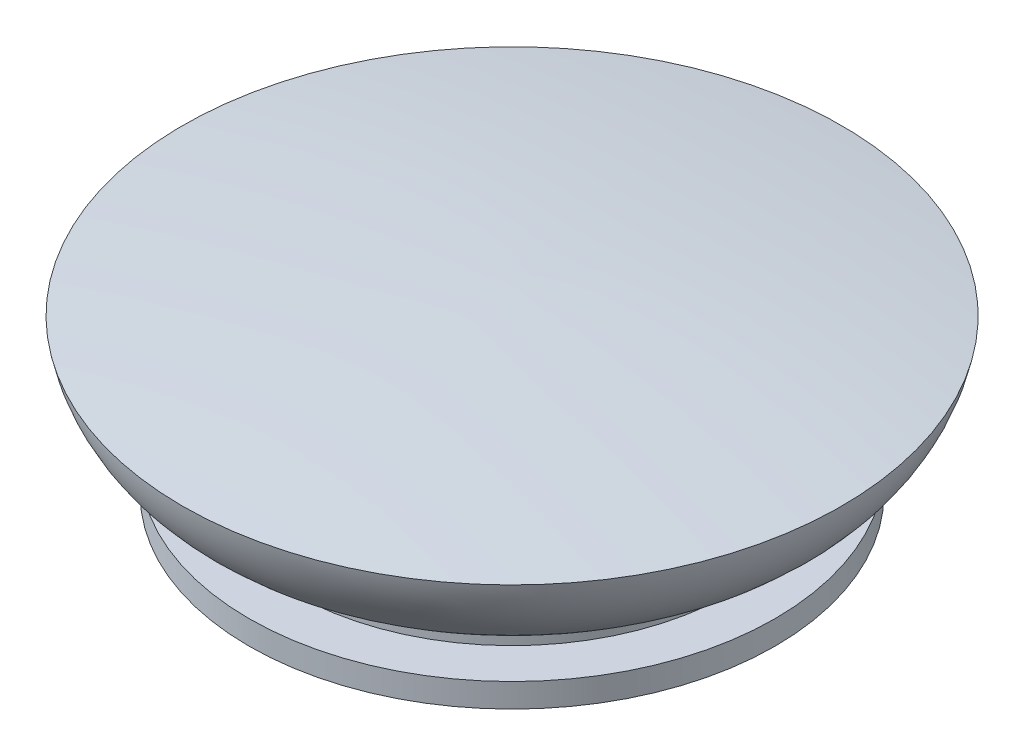
ISO-10303-21;
HEADER;
FILE_DESCRIPTION(('STEP AP214'),'2;1');
FILE_NAME('part.step','',(''),(''),'','','');
FILE_SCHEMA(('AUTOMOTIVE_DESIGN { 1 0 10303 214 1 1 1 1 }'));
ENDSEC;
DATA;
#1=APPLICATION_CONTEXT('core data for automotive mechanical design processes');
#2=APPLICATION_PROTOCOL_DEFINITION('international standard','automotive_design',2000,#1);
#3=PRODUCT_CONTEXT('',#1,'mechanical');
#4=PRODUCT('Part','Part','',(#3));
#5=PRODUCT_RELATED_PRODUCT_CATEGORY('part','',(#4));
#6=PRODUCT_DEFINITION_FORMATION('','',#4);
#7=PRODUCT_DEFINITION_CONTEXT('part definition',#1,'design');
#8=PRODUCT_DEFINITION('design','',#6,#7);
#9=PRODUCT_DEFINITION_SHAPE('','',#8);
#10=(LENGTH_UNIT() NAMED_UNIT(*) SI_UNIT(.MILLI.,.METRE.));
#11=(NAMED_UNIT(*) PLANE_ANGLE_UNIT() SI_UNIT($,.RADIAN.));
#12=(NAMED_UNIT(*) SI_UNIT($,.STERADIAN.) SOLID_ANGLE_UNIT());
#13=UNCERTAINTY_MEASURE_WITH_UNIT(LENGTH_MEASURE(1.E-05),#10,'distance_accuracy_value','');
#14=(GEOMETRIC_REPRESENTATION_CONTEXT(3) GLOBAL_UNCERTAINTY_ASSIGNED_CONTEXT((#13)) GLOBAL_UNIT_ASSIGNED_CONTEXT((#10,
#11,#12)) REPRESENTATION_CONTEXT('',''));
#15=CARTESIAN_POINT('',(0.,0.,0.));
#16=DIRECTION('',(0.,0.,1.));
#17=DIRECTION('',(1.,0.,0.));
#18=AXIS2_PLACEMENT_3D('',#15,#16,#17);
#19=CARTESIAN_POINT('',(0.,0.,0.));
#20=DIRECTION('',(0.,-1.,0.));
#21=DIRECTION('',(0.,0.,-1.));
#22=AXIS2_PLACEMENT_3D('',#19,#20,#21);
#23=PLANE('',#22);
#24=CARTESIAN_POINT('',(0.,0.,0.));
#25=DIRECTION('',(0.,1.,0.));
#26=DIRECTION('',(0.,0.,1.));
#27=AXIS2_PLACEMENT_3D('',#24,#25,#26);
#28=CIRCLE('',#27,47.875);
#29=CARTESIAN_POINT('',(0.,0.,47.875));
#30=VERTEX_POINT('',#29);
#31=EDGE_CURVE('E83',#30,#30,#28,.T.);
#32=ORIENTED_EDGE('',*,*,#31,.F.);
#33=EDGE_LOOP('',(#32));
#34=FACE_BOUND('',#33,.T.);
#35=ADVANCED_FACE('F45',(#34),#23,.T.);
#36=CARTESIAN_POINT('',(0.,-441.590838818162,-8.14865347302971));
#37=DIRECTION('',(-1.,0.,0.));
#38=DIRECTION('',(0.,0.,1.));
#39=AXIS2_PLACEMENT_3D('',#36,#37,#38);
#40=CIRCLE('',#39,474.660789241696);
#41=TRIMMED_CURVE('',#40,(PARAMETER_VALUE(-1.55362816382795)),
(PARAMETER_VALUE(1.55362816382795)),.T.,.PARAMETER.);
#42=CARTESIAN_POINT('',(0.,-441.590838818162,0.));
#43=DIRECTION('',(0.,1.,0.));
#44=AXIS1_PLACEMENT('',#42,#43);
#45=SURFACE_OF_REVOLUTION('',#41,#44);
#46=CARTESIAN_POINT('',(0.,28.1523100125187,0.));
#47=DIRECTION('',(0.,1.,0.));
#48=DIRECTION('',(0.,0.,1.));
#49=AXIS2_PLACEMENT_3D('',#46,#47,#48);
#50=CIRCLE('',#49,60.);
#51=CARTESIAN_POINT('',(0.,28.1523100125187,60.));
#52=VERTEX_POINT('',#51);
#53=EDGE_CURVE('E11',#52,#52,#50,.T.);
#54=ORIENTED_EDGE('',*,*,#53,.T.);
#55=EDGE_LOOP('',(#54));
#56=FACE_BOUND('',#55,.T.);
#57=CARTESIAN_POINT('',(0.,33.,0.));
#58=VERTEX_POINT('',#57);
#59=VERTEX_LOOP('',#58);
#60=FACE_BOUND('',#59,.T.);
#61=ADVANCED_FACE('F55',(#56,#60),#45,.T.);
#62=CARTESIAN_POINT('',(0.,32.5018438347282,0.));
#63=DIRECTION('',(0.,1.,0.));
#64=DIRECTION('',(0.,0.,1.));
#65=AXIS2_PLACEMENT_3D('',#62,#63,#64);
#66=TOROIDAL_SURFACE('',#65,37.0905576775876,23.3186833246323);
#67=CARTESIAN_POINT('',(0.,9.34999999999999,0.));
#68=DIRECTION('',(0.,1.,0.));
#69=DIRECTION('',(0.,0.,1.));
#70=AXIS2_PLACEMENT_3D('',#67,#68,#69);
#71=CIRCLE('',#70,39.875);
#72=CARTESIAN_POINT('',(0.,9.34999999999999,39.875));
#73=VERTEX_POINT('',#72);
#74=EDGE_CURVE('E52',#73,#73,#71,.T.);
#75=ORIENTED_EDGE('',*,*,#74,.T.);
#76=EDGE_LOOP('',(#75));
#77=FACE_BOUND('',#76,.T.);
#78=ORIENTED_EDGE('',*,*,#53,.F.);
#79=EDGE_LOOP('',(#78));
#80=FACE_BOUND('',#79,.T.);
#81=ADVANCED_FACE('F57',(#77,#80),#66,.T.);
#82=CARTESIAN_POINT('',(0.,28.1523100125187,0.));
#83=DIRECTION('',(0.,1.,0.));
#84=DIRECTION('',(0.,0.,1.));
#85=AXIS2_PLACEMENT_3D('',#82,#83,#84);
#86=CYLINDRICAL_SURFACE('',#85,39.875);
#87=CARTESIAN_POINT('',(0.,4.34999999999999,0.));
#88=DIRECTION('',(0.,1.,0.));
#89=DIRECTION('',(0.,0.,1.));
#90=AXIS2_PLACEMENT_3D('',#87,#88,#89);
#91=CIRCLE('',#90,39.875);
#92=CARTESIAN_POINT('',(0.,4.34999999999999,39.875));
#93=VERTEX_POINT('',#92);
#94=EDGE_CURVE('E88',#93,#93,#91,.T.);
#95=ORIENTED_EDGE('',*,*,#94,.T.);
#96=EDGE_LOOP('',(#95));
#97=FACE_BOUND('',#96,.T.);
#98=ORIENTED_EDGE('',*,*,#74,.F.);
#99=EDGE_LOOP('',(#98));
#100=FACE_BOUND('',#99,.T.);
#101=ADVANCED_FACE('F63',(#97,#100),#86,.T.);
#102=CARTESIAN_POINT('',(-47.875,4.34999999999999,0.));
#103=DIRECTION('',(0.,1.,0.));
#104=DIRECTION('',(0.,0.,1.));
#105=AXIS2_PLACEMENT_3D('',#102,#103,#104);
#106=PLANE('',#105);
#107=CARTESIAN_POINT('',(0.,4.34999999999999,0.));
#108=DIRECTION('',(0.,1.,0.));
#109=DIRECTION('',(0.,0.,1.));
#110=AXIS2_PLACEMENT_3D('',#107,#108,#109);
#111=CIRCLE('',#110,47.875);
#112=CARTESIAN_POINT('',(0.,4.34999999999999,47.875));
#113=VERTEX_POINT('',#112);
#114=EDGE_CURVE('E86',#113,#113,#111,.T.);
#115=ORIENTED_EDGE('',*,*,#114,.T.);
#116=EDGE_LOOP('',(#115));
#117=FACE_BOUND('',#116,.T.);
#118=ORIENTED_EDGE('',*,*,#94,.F.);
#119=EDGE_LOOP('',(#118));
#120=FACE_BOUND('',#119,.T.);
#121=ADVANCED_FACE('F70',(#117,#120),#106,.T.);
#122=CARTESIAN_POINT('',(0.,28.1523100125187,0.));
#123=DIRECTION('',(0.,1.,0.));
#124=DIRECTION('',(0.,0.,1.));
#125=AXIS2_PLACEMENT_3D('',#122,#123,#124);
#126=CYLINDRICAL_SURFACE('',#125,47.875);
#127=ORIENTED_EDGE('',*,*,#31,.T.);
#128=EDGE_LOOP('',(#127));
#129=FACE_BOUND('',#128,.T.);
#130=ORIENTED_EDGE('',*,*,#114,.F.);
#131=EDGE_LOOP('',(#130));
#132=FACE_BOUND('',#131,.T.);
#133=ADVANCED_FACE('F74',(#129,#132),#126,.T.);
#134=CLOSED_SHELL('',(#35,#61,#81,#101,#121,#133));
#135=MANIFOLD_SOLID_BREP('B2',#134);
#136=ADVANCED_BREP_SHAPE_REPRESENTATION('',(#18,#135),#14);
#137=SHAPE_DEFINITION_REPRESENTATION(#9,#136);
ENDSEC;
END-ISO-10303-21;
